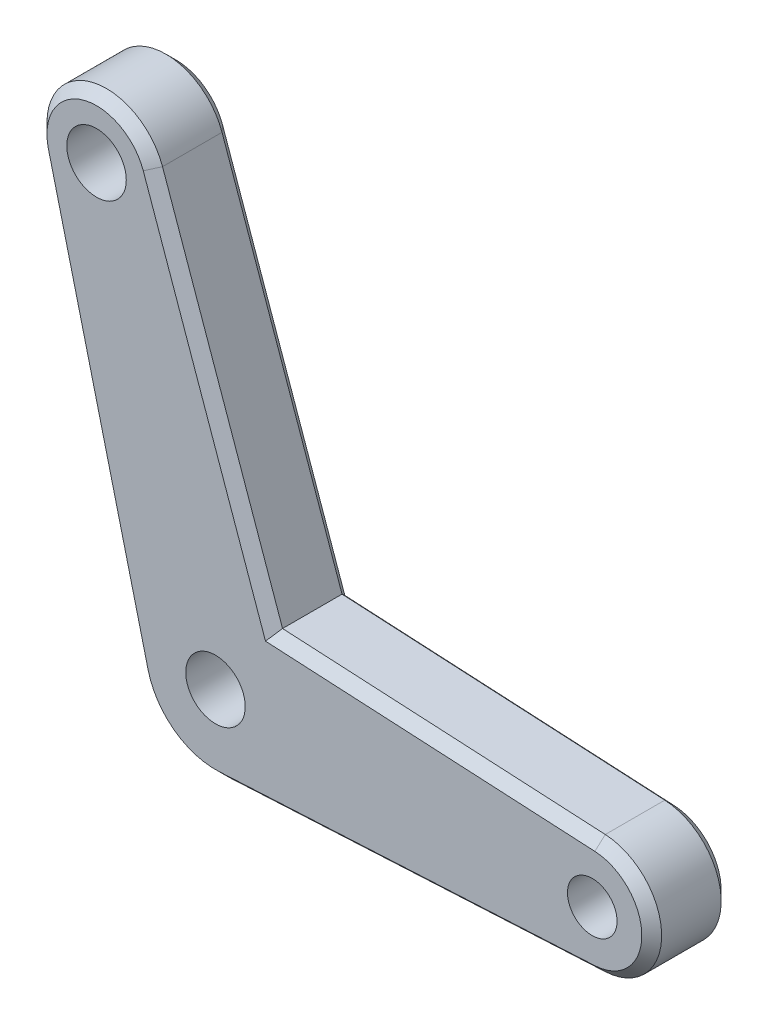
ISO-10303-21;
HEADER;
FILE_DESCRIPTION(('STEP AP214'),'2;1');
FILE_NAME('part.step','',(''),(''),'','','');
FILE_SCHEMA(('AUTOMOTIVE_DESIGN { 1 0 10303 214 1 1 1 1 }'));
ENDSEC;
DATA;
#1=APPLICATION_CONTEXT('core data for automotive mechanical design processes');
#2=APPLICATION_PROTOCOL_DEFINITION('international standard','automotive_design',2000,#1);
#3=PRODUCT_CONTEXT('',#1,'mechanical');
#4=PRODUCT('Part','Part','',(#3));
#5=PRODUCT_RELATED_PRODUCT_CATEGORY('part','',(#4));
#6=PRODUCT_DEFINITION_FORMATION('','',#4);
#7=PRODUCT_DEFINITION_CONTEXT('part definition',#1,'design');
#8=PRODUCT_DEFINITION('design','',#6,#7);
#9=PRODUCT_DEFINITION_SHAPE('','',#8);
#10=(LENGTH_UNIT() NAMED_UNIT(*) SI_UNIT(.MILLI.,.METRE.));
#11=(NAMED_UNIT(*) PLANE_ANGLE_UNIT() SI_UNIT($,.RADIAN.));
#12=(NAMED_UNIT(*) SI_UNIT($,.STERADIAN.) SOLID_ANGLE_UNIT());
#13=UNCERTAINTY_MEASURE_WITH_UNIT(LENGTH_MEASURE(1.E-05),#10,'distance_accuracy_value','');
#14=(GEOMETRIC_REPRESENTATION_CONTEXT(3) GLOBAL_UNCERTAINTY_ASSIGNED_CONTEXT((#13)) GLOBAL_UNIT_ASSIGNED_CONTEXT((#10,
#11,#12)) REPRESENTATION_CONTEXT('',''));
#15=CARTESIAN_POINT('',(0.,0.,0.));
#16=DIRECTION('',(0.,0.,1.));
#17=DIRECTION('',(1.,0.,0.));
#18=AXIS2_PLACEMENT_3D('',#15,#16,#17);
#19=CARTESIAN_POINT('',(0.,0.,-4.));
#20=DIRECTION('',(0.,0.,1.));
#21=DIRECTION('',(1.,0.,0.));
#22=AXIS2_PLACEMENT_3D('',#19,#20,#21);
#23=CYLINDRICAL_SURFACE('',#22,4.);
#24=DIRECTION('',(0.,0.,1.));
#25=VECTOR('',#24,1.);
#26=CARTESIAN_POINT('',(0.210526315789474,-3.99445599179164,-4.));
#27=LINE('',#26,#25);
#28=CARTESIAN_POINT('',(0.210526315789474,-3.99445599179164,-3.5));
#29=VERTEX_POINT('',#28);
#30=CARTESIAN_POINT('',(0.210526315789474,-3.99445599179164,-0.499999999999997));
#31=VERTEX_POINT('',#30);
#32=EDGE_CURVE('E270',#29,#31,#27,.T.);
#33=ORIENTED_EDGE('',*,*,#32,.T.);
#34=CARTESIAN_POINT('',(0.,0.,-0.499999999999997));
#35=DIRECTION('',(0.,0.,1.));
#36=DIRECTION('',(1.,0.,0.));
#37=AXIS2_PLACEMENT_3D('',#34,#35,#36);
#38=CIRCLE('',#37,4.);
#39=CARTESIAN_POINT('',(-3.88195479167233,-0.964586437501699,-0.499999999999997));
#40=VERTEX_POINT('',#39);
#41=EDGE_CURVE('E202',#31,#40,#38,.F.);
#42=ORIENTED_EDGE('',*,*,#41,.T.);
#43=DIRECTION('',(0.,0.,-1.));
#44=VECTOR('',#43,1.);
#45=CARTESIAN_POINT('',(-3.88195479167233,-0.964586437501699,0.));
#46=LINE('',#45,#44);
#47=CARTESIAN_POINT('',(-3.88195479167233,-0.964586437501699,-3.5));
#48=VERTEX_POINT('',#47);
#49=EDGE_CURVE('E273',#40,#48,#46,.T.);
#50=ORIENTED_EDGE('',*,*,#49,.T.);
#51=CARTESIAN_POINT('',(0.,0.,-3.5));
#52=DIRECTION('',(0.,0.,1.));
#53=DIRECTION('',(1.,0.,0.));
#54=AXIS2_PLACEMENT_3D('',#51,#52,#53);
#55=CIRCLE('',#54,4.);
#56=EDGE_CURVE('E200',#48,#29,#55,.T.);
#57=ORIENTED_EDGE('',*,*,#56,.T.);
#58=EDGE_LOOP('',(#33,#42,#50,#57));
#59=FACE_BOUND('',#58,.T.);
#60=ADVANCED_FACE('F41',(#59),#23,.T.);
#61=CARTESIAN_POINT('',(0.210526315789474,3.99445599179164,-4.));
#62=DIRECTION('',(0.0526315789473684,0.998613997947909,0.));
#63=DIRECTION('',(-0.998613997947909,0.0526315789473684,0.));
#64=AXIS2_PLACEMENT_3D('',#61,#62,#63);
#65=PLANE('',#64);
#66=DIRECTION('',(0.,0.,1.));
#67=VECTOR('',#66,1.);
#68=CARTESIAN_POINT('',(2.88149196291794,3.85368374184178,-4.));
#69=LINE('',#68,#67);
#70=CARTESIAN_POINT('',(2.88149196291794,3.85368374184178,-3.5));
#71=VERTEX_POINT('',#70);
#72=CARTESIAN_POINT('',(2.88149196291794,3.85368374184178,-0.499999999999997));
#73=VERTEX_POINT('',#72);
#74=EDGE_CURVE('E171',#71,#73,#69,.T.);
#75=ORIENTED_EDGE('',*,*,#74,.T.);
#76=DIRECTION('',(0.998613997947909,-0.0526315789473684,0.));
#77=VECTOR('',#76,1.);
#78=CARTESIAN_POINT('',(0.210526315789474,3.99445599179164,-0.499999999999997));
#79=LINE('',#78,#77);
#80=CARTESIAN_POINT('',(19.1578947368421,2.99584199384373,-0.499999999999997));
#81=VERTEX_POINT('',#80);
#82=EDGE_CURVE('E214',#73,#81,#79,.T.);
#83=ORIENTED_EDGE('',*,*,#82,.T.);
#84=DIRECTION('',(0.,0.,1.));
#85=VECTOR('',#84,1.);
#86=CARTESIAN_POINT('',(19.1578947368421,2.99584199384373,-4.));
#87=LINE('',#86,#85);
#88=CARTESIAN_POINT('',(19.1578947368421,2.99584199384373,-3.5));
#89=VERTEX_POINT('',#88);
#90=EDGE_CURVE('E282',#89,#81,#87,.T.);
#91=ORIENTED_EDGE('',*,*,#90,.F.);
#92=DIRECTION('',(-0.998613997947909,0.0526315789473684,0.));
#93=VECTOR('',#92,1.);
#94=CARTESIAN_POINT('',(2.88149196291794,3.85368374184178,-3.5));
#95=LINE('',#94,#93);
#96=EDGE_CURVE('E211',#89,#71,#95,.T.);
#97=ORIENTED_EDGE('',*,*,#96,.T.);
#98=EDGE_LOOP('',(#75,#83,#91,#97));
#99=FACE_BOUND('',#98,.T.);
#100=ADVANCED_FACE('F327',(#99),#65,.T.);
#101=CARTESIAN_POINT('',(0.,0.,-4.));
#102=DIRECTION('',(0.,0.,1.));
#103=DIRECTION('',(1.,0.,0.));
#104=AXIS2_PLACEMENT_3D('',#101,#102,#103);
#105=PLANE('',#104);
#106=DIRECTION('',(0.33288972864148,-0.942965762138266,0.));
#107=VECTOR('',#106,1.);
#108=CARTESIAN_POINT('',(3.30038016748393,1.16511405024518,-4.));
#109=LINE('',#108,#107);
#110=CARTESIAN_POINT('',(-3.64258559465434,20.8322243216037,-4.));
#111=VERTEX_POINT('',#110);
#112=CARTESIAN_POINT('',(2.5213054675532,3.37197327411156,-4.));
#113=VERTEX_POINT('',#112);
#114=EDGE_CURVE('E216',#111,#113,#109,.T.);
#115=ORIENTED_EDGE('',*,*,#114,.T.);
#116=DIRECTION('',(0.998613997947909,-0.0526315789473684,0.));
#117=VECTOR('',#116,1.);
#118=CARTESIAN_POINT('',(19.1315789473684,2.49653499486977,-4.));
#119=LINE('',#118,#117);
#120=CARTESIAN_POINT('',(19.1315789473684,2.49653499486977,-4.));
#121=VERTEX_POINT('',#120);
#122=EDGE_CURVE('E11',#113,#121,#119,.T.);
#123=ORIENTED_EDGE('',*,*,#122,.T.);
#124=CARTESIAN_POINT('',(19.,0.,-4.));
#125=DIRECTION('',(0.,0.,1.));
#126=DIRECTION('',(1.,0.,0.));
#127=AXIS2_PLACEMENT_3D('',#124,#125,#126);
#128=CIRCLE('',#127,2.5);
#129=CARTESIAN_POINT('',(19.1315789473684,-2.49653499486977,-4.));
#130=VERTEX_POINT('',#129);
#131=EDGE_CURVE('E51',#121,#130,#128,.F.);
#132=ORIENTED_EDGE('',*,*,#131,.T.);
#133=DIRECTION('',(-0.998613997947909,-0.0526315789473685,0.));
#134=VECTOR('',#133,1.);
#135=CARTESIAN_POINT('',(0.18421052631579,-3.49514899281768,-4.));
#136=LINE('',#135,#134);
#137=CARTESIAN_POINT('',(0.18421052631579,-3.49514899281768,-4.));
#138=VERTEX_POINT('',#137);
#139=EDGE_CURVE('E224',#130,#138,#136,.T.);
#140=ORIENTED_EDGE('',*,*,#139,.T.);
#141=CARTESIAN_POINT('',(0.,0.,-4.));
#142=DIRECTION('',(0.,0.,1.));
#143=DIRECTION('',(1.,0.,0.));
#144=AXIS2_PLACEMENT_3D('',#141,#142,#143);
#145=CIRCLE('',#144,3.5);
#146=CARTESIAN_POINT('',(-3.39671044271329,-0.844013132813987,-4.));
#147=VERTEX_POINT('',#146);
#148=EDGE_CURVE('E222',#138,#147,#145,.F.);
#149=ORIENTED_EDGE('',*,*,#148,.T.);
#150=DIRECTION('',(-0.241146609375425,0.970488697918083,0.));
#151=VECTOR('',#150,1.);
#152=CARTESIAN_POINT('',(-3.39671044271329,-0.844013132813988,-4.));
#153=LINE('',#152,#151);
#154=CARTESIAN_POINT('',(-8.42622174479521,19.3971334765614,-4.));
#155=VERTEX_POINT('',#154);
#156=EDGE_CURVE('E220',#147,#155,#153,.T.);
#157=ORIENTED_EDGE('',*,*,#156,.T.);
#158=CARTESIAN_POINT('',(-6.,20.,-4.));
#159=DIRECTION('',(0.,0.,1.));
#160=DIRECTION('',(1.,0.,0.));
#161=AXIS2_PLACEMENT_3D('',#158,#159,#160);
#162=CIRCLE('',#161,2.5);
#163=EDGE_CURVE('E218',#155,#111,#162,.F.);
#164=ORIENTED_EDGE('',*,*,#163,.T.);
#165=EDGE_LOOP('',(#115,#123,#132,#140,#149,#157,#164));
#166=FACE_BOUND('',#165,.T.);
#167=CARTESIAN_POINT('',(19.,0.,-4.));
#168=DIRECTION('',(0.,0.,1.));
#169=DIRECTION('',(1.,0.,0.));
#170=AXIS2_PLACEMENT_3D('',#167,#168,#169);
#171=CIRCLE('',#170,1.25);
#172=CARTESIAN_POINT('',(20.25,0.,-4.));
#173=VERTEX_POINT('',#172);
#174=EDGE_CURVE('E280',#173,#173,#171,.T.);
#175=ORIENTED_EDGE('',*,*,#174,.T.);
#176=EDGE_LOOP('',(#175));
#177=FACE_BOUND('',#176,.T.);
#178=CARTESIAN_POINT('',(0.,0.,-4.));
#179=DIRECTION('',(0.,0.,1.));
#180=DIRECTION('',(1.,0.,0.));
#181=AXIS2_PLACEMENT_3D('',#178,#179,#180);
#182=CIRCLE('',#181,1.5);
#183=CARTESIAN_POINT('',(1.5,0.,-4.));
#184=VERTEX_POINT('',#183);
#185=EDGE_CURVE('E174',#184,#184,#182,.T.);
#186=ORIENTED_EDGE('',*,*,#185,.T.);
#187=EDGE_LOOP('',(#186));
#188=FACE_BOUND('',#187,.T.);
#189=CARTESIAN_POINT('',(-6.,20.,-4.));
#190=DIRECTION('',(0.,0.,1.));
#191=DIRECTION('',(1.,0.,0.));
#192=AXIS2_PLACEMENT_3D('',#189,#190,#191);
#193=CIRCLE('',#192,1.5);
#194=CARTESIAN_POINT('',(-4.5,20.,-4.));
#195=VERTEX_POINT('',#194);
#196=EDGE_CURVE('E239',#195,#195,#193,.T.);
#197=ORIENTED_EDGE('',*,*,#196,.T.);
#198=EDGE_LOOP('',(#197));
#199=FACE_BOUND('',#198,.T.);
#200=ADVANCED_FACE('F318',(#166,#177,#188,#199),#105,.F.);
#201=CARTESIAN_POINT('',(0.,0.,0.));
#202=DIRECTION('',(0.,0.,1.));
#203=DIRECTION('',(1.,0.,0.));
#204=AXIS2_PLACEMENT_3D('',#201,#202,#203);
#205=PLANE('',#204);
#206=DIRECTION('',(-0.998613997947909,0.0526315789473684,0.));
#207=VECTOR('',#206,1.);
#208=CARTESIAN_POINT('',(0.18421052631579,3.49514899281768,0.));
#209=LINE('',#208,#207);
#210=CARTESIAN_POINT('',(19.1315789473684,2.49653499486977,0.));
#211=VERTEX_POINT('',#210);
#212=CARTESIAN_POINT('',(2.5213054675532,3.37197327411156,0.));
#213=VERTEX_POINT('',#212);
#214=EDGE_CURVE('E150',#211,#213,#209,.T.);
#215=ORIENTED_EDGE('',*,*,#214,.T.);
#216=DIRECTION('',(-0.33288972864148,0.942965762138266,0.));
#217=VECTOR('',#216,1.);
#218=CARTESIAN_POINT('',(-3.64258559465433,20.8322243216037,0.));
#219=LINE('',#218,#217);
#220=CARTESIAN_POINT('',(-3.64258559465434,20.8322243216037,0.));
#221=VERTEX_POINT('',#220);
#222=EDGE_CURVE('E185',#213,#221,#219,.T.);
#223=ORIENTED_EDGE('',*,*,#222,.T.);
#224=CARTESIAN_POINT('',(-6.,20.,0.));
#225=DIRECTION('',(0.,0.,1.));
#226=DIRECTION('',(1.,0.,0.));
#227=AXIS2_PLACEMENT_3D('',#224,#225,#226);
#228=CIRCLE('',#227,2.5);
#229=CARTESIAN_POINT('',(-8.42622174479521,19.3971334765614,0.));
#230=VERTEX_POINT('',#229);
#231=EDGE_CURVE('E183',#221,#230,#228,.T.);
#232=ORIENTED_EDGE('',*,*,#231,.T.);
#233=DIRECTION('',(0.241146609375425,-0.970488697918083,0.));
#234=VECTOR('',#233,1.);
#235=CARTESIAN_POINT('',(-3.39671044271329,-0.844013132813987,0.));
#236=LINE('',#235,#234);
#237=CARTESIAN_POINT('',(-3.39671044271329,-0.844013132813988,0.));
#238=VERTEX_POINT('',#237);
#239=EDGE_CURVE('E181',#230,#238,#236,.T.);
#240=ORIENTED_EDGE('',*,*,#239,.T.);
#241=CARTESIAN_POINT('',(0.,0.,0.));
#242=DIRECTION('',(0.,0.,1.));
#243=DIRECTION('',(1.,0.,0.));
#244=AXIS2_PLACEMENT_3D('',#241,#242,#243);
#245=CIRCLE('',#244,3.5);
#246=CARTESIAN_POINT('',(0.18421052631579,-3.49514899281768,0.));
#247=VERTEX_POINT('',#246);
#248=EDGE_CURVE('E179',#238,#247,#245,.T.);
#249=ORIENTED_EDGE('',*,*,#248,.T.);
#250=DIRECTION('',(0.998613997947909,0.0526315789473685,0.));
#251=VECTOR('',#250,1.);
#252=CARTESIAN_POINT('',(0.18421052631579,-3.49514899281769,0.));
#253=LINE('',#252,#251);
#254=CARTESIAN_POINT('',(19.1315789473684,-2.49653499486977,0.));
#255=VERTEX_POINT('',#254);
#256=EDGE_CURVE('E153',#247,#255,#253,.T.);
#257=ORIENTED_EDGE('',*,*,#256,.T.);
#258=CARTESIAN_POINT('',(19.,0.,0.));
#259=DIRECTION('',(0.,0.,1.));
#260=DIRECTION('',(1.,0.,0.));
#261=AXIS2_PLACEMENT_3D('',#258,#259,#260);
#262=CIRCLE('',#261,2.5);
#263=EDGE_CURVE('E144',#255,#211,#262,.T.);
#264=ORIENTED_EDGE('',*,*,#263,.T.);
#265=EDGE_LOOP('',(#215,#223,#232,#240,#249,#257,#264));
#266=FACE_BOUND('',#265,.T.);
#267=CARTESIAN_POINT('',(19.,0.,0.));
#268=DIRECTION('',(0.,0.,1.));
#269=DIRECTION('',(1.,0.,0.));
#270=AXIS2_PLACEMENT_3D('',#267,#268,#269);
#271=CIRCLE('',#270,1.25);
#272=CARTESIAN_POINT('',(20.25,0.,0.));
#273=VERTEX_POINT('',#272);
#274=EDGE_CURVE('E285',#273,#273,#271,.T.);
#275=ORIENTED_EDGE('',*,*,#274,.F.);
#276=EDGE_LOOP('',(#275));
#277=FACE_BOUND('',#276,.T.);
#278=CARTESIAN_POINT('',(0.,0.,0.));
#279=DIRECTION('',(0.,0.,1.));
#280=DIRECTION('',(1.,0.,0.));
#281=AXIS2_PLACEMENT_3D('',#278,#279,#280);
#282=CIRCLE('',#281,1.5);
#283=CARTESIAN_POINT('',(1.5,0.,0.));
#284=VERTEX_POINT('',#283);
#285=EDGE_CURVE('E290',#284,#284,#282,.T.);
#286=ORIENTED_EDGE('',*,*,#285,.F.);
#287=EDGE_LOOP('',(#286));
#288=FACE_BOUND('',#287,.T.);
#289=CARTESIAN_POINT('',(-6.,20.,0.));
#290=DIRECTION('',(0.,0.,1.));
#291=DIRECTION('',(1.,0.,0.));
#292=AXIS2_PLACEMENT_3D('',#289,#290,#291);
#293=CIRCLE('',#292,1.5);
#294=CARTESIAN_POINT('',(-4.5,20.,0.));
#295=VERTEX_POINT('',#294);
#296=EDGE_CURVE('E307',#295,#295,#293,.T.);
#297=ORIENTED_EDGE('',*,*,#296,.F.);
#298=EDGE_LOOP('',(#297));
#299=FACE_BOUND('',#298,.T.);
#300=ADVANCED_FACE('F146',(#266,#277,#288,#299),#205,.T.);
#301=CARTESIAN_POINT('',(0.,0.,-4.));
#302=DIRECTION('',(0.,0.,1.));
#303=DIRECTION('',(1.,0.,0.));
#304=AXIS2_PLACEMENT_3D('',#301,#302,#303);
#305=CYLINDRICAL_SURFACE('',#304,1.5);
#306=ORIENTED_EDGE('',*,*,#185,.F.);
#307=EDGE_LOOP('',(#306));
#308=FACE_BOUND('',#307,.T.);
#309=ORIENTED_EDGE('',*,*,#285,.T.);
#310=EDGE_LOOP('',(#309));
#311=FACE_BOUND('',#310,.T.);
#312=ADVANCED_FACE('F317',(#308,#311),#305,.F.);
#313=CARTESIAN_POINT('',(19.,0.,-4.));
#314=DIRECTION('',(0.,0.,1.));
#315=DIRECTION('',(1.,0.,0.));
#316=AXIS2_PLACEMENT_3D('',#313,#314,#315);
#317=CYLINDRICAL_SURFACE('',#316,3.);
#318=ORIENTED_EDGE('',*,*,#90,.T.);
#319=CARTESIAN_POINT('',(19.,0.,-0.499999999999997));
#320=DIRECTION('',(0.,0.,1.));
#321=DIRECTION('',(1.,0.,0.));
#322=AXIS2_PLACEMENT_3D('',#319,#320,#321);
#323=CIRCLE('',#322,3.);
#324=CARTESIAN_POINT('',(19.1578947368421,-2.99584199384373,-0.499999999999997));
#325=VERTEX_POINT('',#324);
#326=EDGE_CURVE('E162',#81,#325,#323,.F.);
#327=ORIENTED_EDGE('',*,*,#326,.T.);
#328=DIRECTION('',(0.,0.,1.));
#329=VECTOR('',#328,1.);
#330=CARTESIAN_POINT('',(19.1578947368421,-2.99584199384373,-4.));
#331=LINE('',#330,#329);
#332=CARTESIAN_POINT('',(19.1578947368421,-2.99584199384373,-3.5));
#333=VERTEX_POINT('',#332);
#334=EDGE_CURVE('E279',#333,#325,#331,.T.);
#335=ORIENTED_EDGE('',*,*,#334,.F.);
#336=CARTESIAN_POINT('',(19.,0.,-3.5));
#337=DIRECTION('',(0.,0.,1.));
#338=DIRECTION('',(1.,0.,0.));
#339=AXIS2_PLACEMENT_3D('',#336,#337,#338);
#340=CIRCLE('',#339,3.);
#341=EDGE_CURVE('E208',#333,#89,#340,.T.);
#342=ORIENTED_EDGE('',*,*,#341,.T.);
#343=EDGE_LOOP('',(#318,#327,#335,#342));
#344=FACE_BOUND('',#343,.T.);
#345=ADVANCED_FACE('F324',(#344),#317,.T.);
#346=CARTESIAN_POINT('',(0.210526315789474,-3.99445599179164,-4.));
#347=DIRECTION('',(0.0526315789473685,-0.998613997947909,0.));
#348=DIRECTION('',(0.998613997947909,0.0526315789473685,0.));
#349=AXIS2_PLACEMENT_3D('',#346,#347,#348);
#350=PLANE('',#349);
#351=ORIENTED_EDGE('',*,*,#334,.T.);
#352=DIRECTION('',(-0.998613997947909,-0.0526315789473685,0.));
#353=VECTOR('',#352,1.);
#354=CARTESIAN_POINT('',(0.210526315789474,-3.99445599179164,-0.499999999999997));
#355=LINE('',#354,#353);
#356=EDGE_CURVE('E206',#325,#31,#355,.T.);
#357=ORIENTED_EDGE('',*,*,#356,.T.);
#358=ORIENTED_EDGE('',*,*,#32,.F.);
#359=DIRECTION('',(0.998613997947909,0.0526315789473685,0.));
#360=VECTOR('',#359,1.);
#361=CARTESIAN_POINT('',(19.1578947368421,-2.99584199384373,-3.5));
#362=LINE('',#361,#360);
#363=EDGE_CURVE('E204',#29,#333,#362,.T.);
#364=ORIENTED_EDGE('',*,*,#363,.T.);
#365=EDGE_LOOP('',(#351,#357,#358,#364));
#366=FACE_BOUND('',#365,.T.);
#367=ADVANCED_FACE('F276',(#366),#350,.T.);
#368=CARTESIAN_POINT('',(19.,0.,-4.));
#369=DIRECTION('',(0.,0.,1.));
#370=DIRECTION('',(1.,0.,0.));
#371=AXIS2_PLACEMENT_3D('',#368,#369,#370);
#372=CYLINDRICAL_SURFACE('',#371,1.25);
#373=ORIENTED_EDGE('',*,*,#174,.F.);
#374=EDGE_LOOP('',(#373));
#375=FACE_BOUND('',#374,.T.);
#376=ORIENTED_EDGE('',*,*,#274,.T.);
#377=EDGE_LOOP('',(#376));
#378=FACE_BOUND('',#377,.T.);
#379=ADVANCED_FACE('F340',(#375,#378),#372,.F.);
#380=CARTESIAN_POINT('',(-6.,20.,0.));
#381=DIRECTION('',(0.,0.,-1.));
#382=DIRECTION('',(-1.,0.,0.));
#383=AXIS2_PLACEMENT_3D('',#380,#381,#382);
#384=CYLINDRICAL_SURFACE('',#383,3.);
#385=DIRECTION('',(0.,0.,-1.));
#386=VECTOR('',#385,1.);
#387=CARTESIAN_POINT('',(-8.91146609375425,19.2765601718737,0.));
#388=LINE('',#387,#386);
#389=CARTESIAN_POINT('',(-8.91146609375425,19.2765601718737,-0.499999999999997));
#390=VERTEX_POINT('',#389);
#391=CARTESIAN_POINT('',(-8.91146609375425,19.2765601718737,-3.5));
#392=VERTEX_POINT('',#391);
#393=EDGE_CURVE('E299',#390,#392,#388,.T.);
#394=ORIENTED_EDGE('',*,*,#393,.F.);
#395=CARTESIAN_POINT('',(-6.,20.,-0.499999999999997));
#396=DIRECTION('',(0.,0.,1.));
#397=DIRECTION('',(1.,0.,0.));
#398=AXIS2_PLACEMENT_3D('',#395,#396,#397);
#399=CIRCLE('',#398,3.);
#400=CARTESIAN_POINT('',(-3.1711027135852,20.9986691859244,-0.499999999999997));
#401=VERTEX_POINT('',#400);
#402=EDGE_CURVE('E194',#390,#401,#399,.F.);
#403=ORIENTED_EDGE('',*,*,#402,.T.);
#404=DIRECTION('',(0.,0.,-1.));
#405=VECTOR('',#404,1.);
#406=CARTESIAN_POINT('',(-3.1711027135852,20.9986691859244,0.));
#407=LINE('',#406,#405);
#408=CARTESIAN_POINT('',(-3.1711027135852,20.9986691859244,-3.5));
#409=VERTEX_POINT('',#408);
#410=EDGE_CURVE('E304',#401,#409,#407,.T.);
#411=ORIENTED_EDGE('',*,*,#410,.T.);
#412=CARTESIAN_POINT('',(-6.,20.,-3.5));
#413=DIRECTION('',(0.,0.,1.));
#414=DIRECTION('',(1.,0.,0.));
#415=AXIS2_PLACEMENT_3D('',#412,#413,#414);
#416=CIRCLE('',#415,3.);
#417=EDGE_CURVE('E192',#409,#392,#416,.T.);
#418=ORIENTED_EDGE('',*,*,#417,.T.);
#419=EDGE_LOOP('',(#394,#403,#411,#418));
#420=FACE_BOUND('',#419,.T.);
#421=ADVANCED_FACE('F345',(#420),#384,.T.);
#422=CARTESIAN_POINT('',(-8.91146609375425,19.2765601718737,0.));
#423=DIRECTION('',(0.970488697918083,0.241146609375425,0.));
#424=DIRECTION('',(-0.241146609375425,0.970488697918083,0.));
#425=AXIS2_PLACEMENT_3D('',#422,#423,#424);
#426=PLANE('',#425);
#427=ORIENTED_EDGE('',*,*,#49,.F.);
#428=DIRECTION('',(-0.241146609375425,0.970488697918083,0.));
#429=VECTOR('',#428,1.);
#430=CARTESIAN_POINT('',(-8.91146609375425,19.2765601718737,-0.499999999999997));
#431=LINE('',#430,#429);
#432=EDGE_CURVE('E198',#40,#390,#431,.T.);
#433=ORIENTED_EDGE('',*,*,#432,.T.);
#434=ORIENTED_EDGE('',*,*,#393,.T.);
#435=DIRECTION('',(0.241146609375425,-0.970488697918083,0.));
#436=VECTOR('',#435,1.);
#437=CARTESIAN_POINT('',(-8.91146609375425,19.2765601718737,-3.5));
#438=LINE('',#437,#436);
#439=EDGE_CURVE('E196',#392,#48,#438,.T.);
#440=ORIENTED_EDGE('',*,*,#439,.T.);
#441=EDGE_LOOP('',(#427,#433,#434,#440));
#442=FACE_BOUND('',#441,.T.);
#443=ADVANCED_FACE('F349',(#442),#426,.F.);
#444=CARTESIAN_POINT('',(-3.1711027135852,20.9986691859244,0.));
#445=DIRECTION('',(-0.942965762138266,-0.33288972864148,0.));
#446=DIRECTION('',(0.33288972864148,-0.942965762138266,0.));
#447=AXIS2_PLACEMENT_3D('',#444,#445,#446);
#448=PLANE('',#447);
#449=ORIENTED_EDGE('',*,*,#410,.F.);
#450=DIRECTION('',(0.33288972864148,-0.942965762138266,0.));
#451=VECTOR('',#450,1.);
#452=CARTESIAN_POINT('',(2.88149196291794,3.85368374184178,-0.499999999999997));
#453=LINE('',#452,#451);
#454=EDGE_CURVE('E189',#401,#73,#453,.T.);
#455=ORIENTED_EDGE('',*,*,#454,.T.);
#456=ORIENTED_EDGE('',*,*,#74,.F.);
#457=DIRECTION('',(-0.33288972864148,0.942965762138266,0.));
#458=VECTOR('',#457,1.);
#459=CARTESIAN_POINT('',(-3.1711027135852,20.9986691859244,-3.5));
#460=LINE('',#459,#458);
#461=EDGE_CURVE('E187',#71,#409,#460,.T.);
#462=ORIENTED_EDGE('',*,*,#461,.T.);
#463=EDGE_LOOP('',(#449,#455,#456,#462));
#464=FACE_BOUND('',#463,.T.);
#465=ADVANCED_FACE('F353',(#464),#448,.F.);
#466=CARTESIAN_POINT('',(-6.,20.,0.));
#467=DIRECTION('',(0.,0.,-1.));
#468=DIRECTION('',(-1.,0.,0.));
#469=AXIS2_PLACEMENT_3D('',#466,#467,#468);
#470=CYLINDRICAL_SURFACE('',#469,1.5);
#471=ORIENTED_EDGE('',*,*,#296,.T.);
#472=EDGE_LOOP('',(#471));
#473=FACE_BOUND('',#472,.T.);
#474=ORIENTED_EDGE('',*,*,#196,.F.);
#475=EDGE_LOOP('',(#474));
#476=FACE_BOUND('',#475,.T.);
#477=ADVANCED_FACE('F313',(#473,#476),#470,.F.);
#478=CARTESIAN_POINT('',(0.18421052631579,-3.49514899281768,0.));
#479=DIRECTION('',(-0.0372161463782393,0.706126729736774,-0.707106781186549));
#480=DIRECTION('',(0.998613997947909,0.0526315789473685,0.));
#481=AXIS2_PLACEMENT_3D('',#478,#479,#480);
#482=PLANE('',#481);
#483=DIRECTION('',(0.0372161463782383,-0.706126729736777,-0.707106781186546));
#484=VECTOR('',#483,1.);
#485=CARTESIAN_POINT('',(19.1315789473684,-2.49653499486978,0.));
#486=LINE('',#485,#484);
#487=EDGE_CURVE('E234',#255,#325,#486,.T.);
#488=ORIENTED_EDGE('',*,*,#487,.F.);
#489=ORIENTED_EDGE('',*,*,#256,.F.);
#490=DIRECTION('',(-0.0372161463782394,0.706126729736777,0.707106781186546));
#491=VECTOR('',#490,1.);
#492=CARTESIAN_POINT('',(0.210526315789474,-3.99445599179164,-0.499999999999997));
#493=LINE('',#492,#491);
#494=EDGE_CURVE('E236',#31,#247,#493,.T.);
#495=ORIENTED_EDGE('',*,*,#494,.F.);
#496=ORIENTED_EDGE('',*,*,#356,.F.);
#497=EDGE_LOOP('',(#488,#489,#495,#496));
#498=FACE_BOUND('',#497,.T.);
#499=ADVANCED_FACE('F359',(#498),#482,.F.);
#500=CARTESIAN_POINT('',(0.,0.,0.));
#501=DIRECTION('',(0.,0.,-1.));
#502=DIRECTION('',(-1.,0.,0.));
#503=AXIS2_PLACEMENT_3D('',#500,#501,#502);
#504=CONICAL_SURFACE('',#503,3.5,0.78539816339745);
#505=ORIENTED_EDGE('',*,*,#494,.T.);
#506=ORIENTED_EDGE('',*,*,#248,.F.);
#507=DIRECTION('',(0.68623913936278,0.170516402749507,0.707106781186547));
#508=VECTOR('',#507,1.);
#509=CARTESIAN_POINT('',(-3.88195479167233,-0.9645864375017,-0.499999999999997));
#510=LINE('',#509,#508);
#511=EDGE_CURVE('E165',#40,#238,#510,.T.);
#512=ORIENTED_EDGE('',*,*,#511,.F.);
#513=ORIENTED_EDGE('',*,*,#41,.F.);
#514=EDGE_LOOP('',(#505,#506,#512,#513));
#515=FACE_BOUND('',#514,.T.);
#516=ADVANCED_FACE('F363',(#515),#504,.T.);
#517=CARTESIAN_POINT('',(19.,0.,0.));
#518=DIRECTION('',(0.,0.,-1.));
#519=DIRECTION('',(-1.,0.,0.));
#520=AXIS2_PLACEMENT_3D('',#517,#518,#519);
#521=CONICAL_SURFACE('',#520,2.5,0.78539816339745);
#522=ORIENTED_EDGE('',*,*,#487,.T.);
#523=ORIENTED_EDGE('',*,*,#326,.F.);
#524=DIRECTION('',(0.0372161463782382,0.706126729736777,-0.707106781186546));
#525=VECTOR('',#524,1.);
#526=CARTESIAN_POINT('',(19.1315789473684,2.49653499486977,0.));
#527=LINE('',#526,#525);
#528=EDGE_CURVE('E160',#211,#81,#527,.T.);
#529=ORIENTED_EDGE('',*,*,#528,.F.);
#530=ORIENTED_EDGE('',*,*,#263,.F.);
#531=EDGE_LOOP('',(#522,#523,#529,#530));
#532=FACE_BOUND('',#531,.T.);
#533=ADVANCED_FACE('F161',(#532),#521,.T.);
#534=CARTESIAN_POINT('',(-3.39671044271329,-0.844013132813987,0.));
#535=DIRECTION('',(-0.686239139362777,-0.170516402749506,0.70710678118655));
#536=DIRECTION('',(-0.241146609375425,0.970488697918083,0.));
#537=AXIS2_PLACEMENT_3D('',#534,#535,#536);
#538=PLANE('',#537);
#539=ORIENTED_EDGE('',*,*,#511,.T.);
#540=ORIENTED_EDGE('',*,*,#239,.F.);
#541=DIRECTION('',(0.686239139362782,0.170516402749505,0.707106781186546));
#542=VECTOR('',#541,1.);
#543=CARTESIAN_POINT('',(-8.91146609375425,19.2765601718737,-0.499999999999997));
#544=LINE('',#543,#542);
#545=EDGE_CURVE('E166',#390,#230,#544,.T.);
#546=ORIENTED_EDGE('',*,*,#545,.F.);
#547=ORIENTED_EDGE('',*,*,#432,.F.);
#548=EDGE_LOOP('',(#539,#540,#546,#547));
#549=FACE_BOUND('',#548,.T.);
#550=ADVANCED_FACE('F440',(#549),#538,.T.);
#551=CARTESIAN_POINT('',(0.18421052631579,3.49514899281768,0.));
#552=DIRECTION('',(-0.0372161463782393,-0.706126729736774,-0.707106781186549));
#553=DIRECTION('',(-0.998613997947909,0.0526315789473684,0.));
#554=AXIS2_PLACEMENT_3D('',#551,#552,#553);
#555=PLANE('',#554);
#556=ORIENTED_EDGE('',*,*,#528,.T.);
#557=ORIENTED_EDGE('',*,*,#82,.F.);
#558=DIRECTION('',(0.460500431404405,0.615869503872299,-0.639252772286867));
#559=VECTOR('',#558,1.);
#560=CARTESIAN_POINT('',(2.06063324190196,2.75587401402112,0.639491251864877));
#561=LINE('',#560,#559);
#562=EDGE_CURVE('E169',#213,#73,#561,.T.);
#563=ORIENTED_EDGE('',*,*,#562,.F.);
#564=ORIENTED_EDGE('',*,*,#214,.F.);
#565=EDGE_LOOP('',(#556,#557,#563,#564));
#566=FACE_BOUND('',#565,.T.);
#567=ADVANCED_FACE('F168',(#566),#555,.F.);
#568=CARTESIAN_POINT('',(-6.,20.,0.));
#569=DIRECTION('',(0.,0.,-1.));
#570=DIRECTION('',(-1.,0.,0.));
#571=AXIS2_PLACEMENT_3D('',#568,#569,#570);
#572=CONICAL_SURFACE('',#571,2.5,0.78539816339745);
#573=ORIENTED_EDGE('',*,*,#545,.T.);
#574=ORIENTED_EDGE('',*,*,#231,.F.);
#575=DIRECTION('',(-0.666777484834711,-0.235388584509739,0.707106781186546));
#576=VECTOR('',#575,1.);
#577=CARTESIAN_POINT('',(-3.1711027135852,20.9986691859244,-0.499999999999997));
#578=LINE('',#577,#576);
#579=EDGE_CURVE('E227',#401,#221,#578,.T.);
#580=ORIENTED_EDGE('',*,*,#579,.F.);
#581=ORIENTED_EDGE('',*,*,#402,.F.);
#582=EDGE_LOOP('',(#573,#574,#580,#581));
#583=FACE_BOUND('',#582,.T.);
#584=ADVANCED_FACE('F420',(#583),#572,.T.);
#585=CARTESIAN_POINT('',(3.30038016748393,1.16511405024518,0.));
#586=DIRECTION('',(0.666777484834709,0.23538858450974,0.707106781186547));
#587=DIRECTION('',(0.33288972864148,-0.942965762138266,0.));
#588=AXIS2_PLACEMENT_3D('',#585,#586,#587);
#589=PLANE('',#588);
#590=ORIENTED_EDGE('',*,*,#562,.T.);
#591=ORIENTED_EDGE('',*,*,#454,.F.);
#592=ORIENTED_EDGE('',*,*,#579,.T.);
#593=ORIENTED_EDGE('',*,*,#222,.F.);
#594=EDGE_LOOP('',(#590,#591,#592,#593));
#595=FACE_BOUND('',#594,.T.);
#596=ADVANCED_FACE('F416',(#595),#589,.T.);
#597=CARTESIAN_POINT('',(0.,0.,-3.5));
#598=DIRECTION('',(0.,0.,1.));
#599=DIRECTION('',(1.,0.,0.));
#600=AXIS2_PLACEMENT_3D('',#597,#598,#599);
#601=CONICAL_SURFACE('',#600,4.,0.785398163397451);
#602=DIRECTION('',(-0.0372161463782395,0.706126729736778,-0.707106781186545));
#603=VECTOR('',#602,1.);
#604=CARTESIAN_POINT('',(0.210526315789474,-3.99445599179164,-3.5));
#605=LINE('',#604,#603);
#606=EDGE_CURVE('E251',#29,#138,#605,.T.);
#607=ORIENTED_EDGE('',*,*,#606,.F.);
#608=ORIENTED_EDGE('',*,*,#56,.F.);
#609=DIRECTION('',(-0.686239139362781,-0.170516402749507,0.707106781186545));
#610=VECTOR('',#609,1.);
#611=CARTESIAN_POINT('',(-3.39671044271329,-0.844013132813988,-4.));
#612=LINE('',#611,#610);
#613=EDGE_CURVE('E46',#147,#48,#612,.T.);
#614=ORIENTED_EDGE('',*,*,#613,.F.);
#615=ORIENTED_EDGE('',*,*,#148,.F.);
#616=EDGE_LOOP('',(#607,#608,#614,#615));
#617=FACE_BOUND('',#616,.T.);
#618=ADVANCED_FACE('F44',(#617),#601,.T.);
#619=CARTESIAN_POINT('',(-8.91146609375425,19.2765601718737,-3.5));
#620=DIRECTION('',(0.686239139362777,0.170516402749506,0.70710678118655));
#621=DIRECTION('',(0.241146609375425,-0.970488697918083,0.));
#622=AXIS2_PLACEMENT_3D('',#619,#620,#621);
#623=PLANE('',#622);
#624=ORIENTED_EDGE('',*,*,#613,.T.);
#625=ORIENTED_EDGE('',*,*,#439,.F.);
#626=DIRECTION('',(-0.686239139362782,-0.170516402749506,0.707106781186545));
#627=VECTOR('',#626,1.);
#628=CARTESIAN_POINT('',(-8.42622174479521,19.3971334765614,-4.));
#629=LINE('',#628,#627);
#630=EDGE_CURVE('E249',#155,#392,#629,.T.);
#631=ORIENTED_EDGE('',*,*,#630,.F.);
#632=ORIENTED_EDGE('',*,*,#156,.F.);
#633=EDGE_LOOP('',(#624,#625,#631,#632));
#634=FACE_BOUND('',#633,.T.);
#635=ADVANCED_FACE('F261',(#634),#623,.F.);
#636=CARTESIAN_POINT('',(0.210526315789474,-3.99445599179164,-3.5));
#637=DIRECTION('',(0.0372161463782393,-0.706126729736774,-0.70710678118655));
#638=DIRECTION('',(-0.998613997947909,-0.0526315789473685,0.));
#639=AXIS2_PLACEMENT_3D('',#636,#637,#638);
#640=PLANE('',#639);
#641=ORIENTED_EDGE('',*,*,#606,.T.);
#642=ORIENTED_EDGE('',*,*,#139,.F.);
#643=DIRECTION('',(-0.0372161463782382,0.706126729736778,-0.707106781186546));
#644=VECTOR('',#643,1.);
#645=CARTESIAN_POINT('',(19.1578947368421,-2.99584199384373,-3.5));
#646=LINE('',#645,#644);
#647=EDGE_CURVE('E246',#333,#130,#646,.T.);
#648=ORIENTED_EDGE('',*,*,#647,.F.);
#649=ORIENTED_EDGE('',*,*,#363,.F.);
#650=EDGE_LOOP('',(#641,#642,#648,#649));
#651=FACE_BOUND('',#650,.T.);
#652=ADVANCED_FACE('F404',(#651),#640,.T.);
#653=CARTESIAN_POINT('',(-6.,20.,-3.5));
#654=DIRECTION('',(0.,0.,1.));
#655=DIRECTION('',(1.,0.,0.));
#656=AXIS2_PLACEMENT_3D('',#653,#654,#655);
#657=CONICAL_SURFACE('',#656,3.,0.785398163397451);
#658=ORIENTED_EDGE('',*,*,#630,.T.);
#659=ORIENTED_EDGE('',*,*,#417,.F.);
#660=DIRECTION('',(0.66677748483471,0.235388584509743,0.707106781186546));
#661=VECTOR('',#660,1.);
#662=CARTESIAN_POINT('',(-3.64258559465434,20.8322243216037,-4.));
#663=LINE('',#662,#661);
#664=EDGE_CURVE('E243',#111,#409,#663,.T.);
#665=ORIENTED_EDGE('',*,*,#664,.F.);
#666=ORIENTED_EDGE('',*,*,#163,.F.);
#667=EDGE_LOOP('',(#658,#659,#665,#666));
#668=FACE_BOUND('',#667,.T.);
#669=ADVANCED_FACE('F397',(#668),#657,.T.);
#670=CARTESIAN_POINT('',(19.,0.,-3.5));
#671=DIRECTION('',(0.,0.,1.));
#672=DIRECTION('',(1.,0.,0.));
#673=AXIS2_PLACEMENT_3D('',#670,#671,#672);
#674=CONICAL_SURFACE('',#673,3.,0.785398163397451);
#675=ORIENTED_EDGE('',*,*,#647,.T.);
#676=ORIENTED_EDGE('',*,*,#131,.F.);
#677=DIRECTION('',(-0.0372161463782382,-0.706126729736778,-0.707106781186546));
#678=VECTOR('',#677,1.);
#679=CARTESIAN_POINT('',(19.1578947368421,2.99584199384373,-3.5));
#680=LINE('',#679,#678);
#681=EDGE_CURVE('E59',#89,#121,#680,.T.);
#682=ORIENTED_EDGE('',*,*,#681,.F.);
#683=ORIENTED_EDGE('',*,*,#341,.F.);
#684=EDGE_LOOP('',(#675,#676,#682,#683));
#685=FACE_BOUND('',#684,.T.);
#686=ADVANCED_FACE('F390',(#685),#674,.T.);
#687=CARTESIAN_POINT('',(-3.1711027135852,20.9986691859244,-3.5));
#688=DIRECTION('',(-0.666777484834707,-0.235388584509739,0.70710678118655));
#689=DIRECTION('',(-0.33288972864148,0.942965762138266,0.));
#690=AXIS2_PLACEMENT_3D('',#687,#688,#689);
#691=PLANE('',#690);
#692=ORIENTED_EDGE('',*,*,#664,.T.);
#693=ORIENTED_EDGE('',*,*,#461,.F.);
#694=DIRECTION('',(0.460500431404408,0.615869503872298,0.639252772286866));
#695=VECTOR('',#694,1.);
#696=CARTESIAN_POINT('',(2.35500941931652,3.14957030173843,-4.23084714498843));
#697=LINE('',#696,#695);
#698=EDGE_CURVE('E240',#113,#71,#697,.T.);
#699=ORIENTED_EDGE('',*,*,#698,.F.);
#700=ORIENTED_EDGE('',*,*,#114,.F.);
#701=EDGE_LOOP('',(#692,#693,#699,#700));
#702=FACE_BOUND('',#701,.T.);
#703=ADVANCED_FACE('F384',(#702),#691,.F.);
#704=CARTESIAN_POINT('',(0.210526315789474,3.99445599179164,-3.5));
#705=DIRECTION('',(0.0372161463782393,0.706126729736774,-0.70710678118655));
#706=DIRECTION('',(0.998613997947909,-0.0526315789473684,0.));
#707=AXIS2_PLACEMENT_3D('',#704,#705,#706);
#708=PLANE('',#707);
#709=ORIENTED_EDGE('',*,*,#681,.T.);
#710=ORIENTED_EDGE('',*,*,#122,.F.);
#711=ORIENTED_EDGE('',*,*,#698,.T.);
#712=ORIENTED_EDGE('',*,*,#96,.F.);
#713=EDGE_LOOP('',(#709,#710,#711,#712));
#714=FACE_BOUND('',#713,.T.);
#715=ADVANCED_FACE('F378',(#714),#708,.T.);
#716=CLOSED_SHELL('',(#60,#100,#200,#300,#312,#345,#367,#379,#421,#443,#465,#477,#499,#516,#533,
#550,#567,#584,#596,#618,#635,#652,#669,#686,#703,#715));
#717=MANIFOLD_SOLID_BREP('B2',#716);
#718=ADVANCED_BREP_SHAPE_REPRESENTATION('',(#18,#717),#14);
#719=SHAPE_DEFINITION_REPRESENTATION(#9,#718);
ENDSEC;
END-ISO-10303-21;
